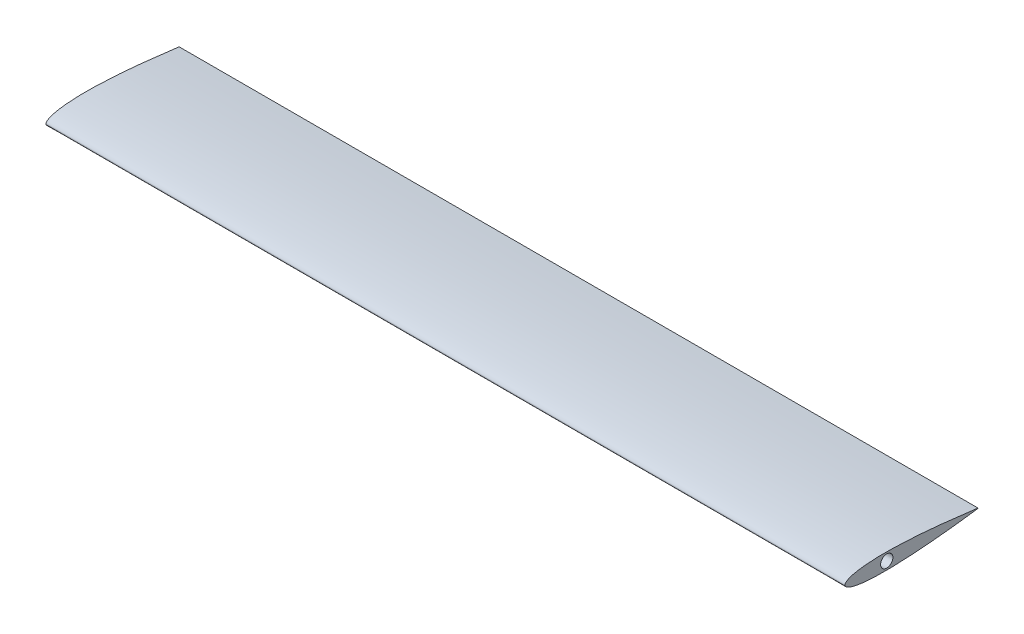
ISO-10303-21;
HEADER;
FILE_DESCRIPTION(('STEP AP214'),'2;1');
FILE_NAME('part.step','',(''),(''),'','','');
FILE_SCHEMA(('AUTOMOTIVE_DESIGN { 1 0 10303 214 1 1 1 1 }'));
ENDSEC;
DATA;
#1=APPLICATION_CONTEXT('core data for automotive mechanical design processes');
#2=APPLICATION_PROTOCOL_DEFINITION('international standard','automotive_design',2000,#1);
#3=PRODUCT_CONTEXT('',#1,'mechanical');
#4=PRODUCT('Part','Part','',(#3));
#5=PRODUCT_RELATED_PRODUCT_CATEGORY('part','',(#4));
#6=PRODUCT_DEFINITION_FORMATION('','',#4);
#7=PRODUCT_DEFINITION_CONTEXT('part definition',#1,'design');
#8=PRODUCT_DEFINITION('design','',#6,#7);
#9=PRODUCT_DEFINITION_SHAPE('','',#8);
#10=(LENGTH_UNIT() NAMED_UNIT(*) SI_UNIT(.MILLI.,.METRE.));
#11=(NAMED_UNIT(*) PLANE_ANGLE_UNIT() SI_UNIT($,.RADIAN.));
#12=(NAMED_UNIT(*) SI_UNIT($,.STERADIAN.) SOLID_ANGLE_UNIT());
#13=UNCERTAINTY_MEASURE_WITH_UNIT(LENGTH_MEASURE(1.E-05),#10,'distance_accuracy_value','');
#14=(GEOMETRIC_REPRESENTATION_CONTEXT(3) GLOBAL_UNCERTAINTY_ASSIGNED_CONTEXT((#13)) GLOBAL_UNIT_ASSIGNED_CONTEXT((#10,
#11,#12)) REPRESENTATION_CONTEXT('',''));
#15=CARTESIAN_POINT('',(0.,0.,0.));
#16=DIRECTION('',(0.,0.,1.));
#17=DIRECTION('',(1.,0.,0.));
#18=AXIS2_PLACEMENT_3D('',#15,#16,#17);
#19=CARTESIAN_POINT('',(750.,7.69748541026481,-124.995841148639));
#20=CARTESIAN_POINT('',(750.,8.13297079806969,-121.549441339967));
#21=CARTESIAN_POINT('',(750.,8.8711094317515,-115.707865670304));
#22=CARTESIAN_POINT('',(750.,10.001168495884,-106.612829462784));
#23=CARTESIAN_POINT('',(750.,10.900080960327,-98.7766774485687));
#24=CARTESIAN_POINT('',(750.,11.7180797430692,-91.0104309827741));
#25=CARTESIAN_POINT('',(750.,12.374421583348,-84.4661711660079));
#26=CARTESIAN_POINT('',(750.,13.0108919100097,-77.1231270334049));
#27=CARTESIAN_POINT('',(750.,13.6615586610673,-70.096902966347));
#28=CARTESIAN_POINT('',(750.,14.0382624320619,-63.2321869691896));
#29=CARTESIAN_POINT('',(750.,14.4586464854716,-56.9511833567442));
#30=CARTESIAN_POINT('',(750.,14.7447792836539,-50.1830543119707));
#31=CARTESIAN_POINT('',(750.,14.9288477277546,-43.7131494322692));
#32=CARTESIAN_POINT('',(750.,14.9867694495661,-38.0167473663419));
#33=CARTESIAN_POINT('',(750.,14.9641673572682,-31.8671085177231));
#34=CARTESIAN_POINT('',(750.,14.7641718889759,-25.9611084011886));
#35=CARTESIAN_POINT('',(750.,14.3189228100668,-20.4184783683121));
#36=CARTESIAN_POINT('',(750.,13.9020772787466,-16.0808939192611));
#37=CARTESIAN_POINT('',(750.,13.2766805127196,-11.948417440773));
#38=CARTESIAN_POINT('',(750.,12.4387478677314,-7.87202213430819));
#39=CARTESIAN_POINT('',(750.,11.4815907628938,-4.55145990959005));
#40=CARTESIAN_POINT('',(750.,10.1896156908138,-1.93507828303653));
#41=CARTESIAN_POINT('',(750.,8.86775259773538,-0.419790589282026));
#42=CARTESIAN_POINT('',(750.,7.67644804525767,0.11632820232294));
#43=CARTESIAN_POINT('',(750.,6.57571630783656,-0.228543288672665));
#44=CARTESIAN_POINT('',(750.,5.38282804272362,-1.09205976929891));
#45=CARTESIAN_POINT('',(750.,4.18267580665149,-3.12132983163146));
#46=CARTESIAN_POINT('',(750.,3.12236016112023,-5.83394586751756));
#47=CARTESIAN_POINT('',(750.,2.33803973933592,-8.96942484585597));
#48=CARTESIAN_POINT('',(750.,1.63555506566896,-12.4549344479186));
#49=CARTESIAN_POINT('',(750.,1.05762224526141,-16.3980412905516));
#50=CARTESIAN_POINT('',(750.,0.619305341649041,-20.4073734698152));
#51=CARTESIAN_POINT('',(750.,0.31851410484638,-24.9404968445985));
#52=CARTESIAN_POINT('',(750.,0.0979146932351296,-28.9969109003526));
#53=CARTESIAN_POINT('',(750.,0.0649508194327663,-33.6403576750408));
#54=CARTESIAN_POINT('',(750.,-0.00877400175199696,-37.6198248379226));
#55=CARTESIAN_POINT('',(750.,0.015166900275881,-42.1302311610639));
#56=CARTESIAN_POINT('',(750.,0.128099619747481,-46.8254786090486));
#57=CARTESIAN_POINT('',(750.,0.308197082911385,-52.0592292594811));
#58=CARTESIAN_POINT('',(750.,0.566048003035137,-57.5702731705481));
#59=CARTESIAN_POINT('',(750.,0.903534980744857,-63.0665569396856));
#60=CARTESIAN_POINT('',(750.,1.27356010427155,-68.7815874397308));
#61=CARTESIAN_POINT('',(750.,1.70119585281695,-74.2410513997578));
#62=CARTESIAN_POINT('',(750.,2.13196813018693,-79.3320789909935));
#63=CARTESIAN_POINT('',(750.,2.52583779535599,-83.7651352480584));
#64=CARTESIAN_POINT('',(750.,3.01497217512738,-88.3338625479964));
#65=CARTESIAN_POINT('',(750.,3.49549121200945,-93.4518819084549));
#66=CARTESIAN_POINT('',(750.,4.03066318219639,-98.4485149275409));
#67=CARTESIAN_POINT('',(750.,4.55967089304909,-103.359945305802));
#68=CARTESIAN_POINT('',(750.,5.05105140142525,-107.534749069242));
#69=CARTESIAN_POINT('',(750.,5.65258932830013,-112.036034411145));
#70=CARTESIAN_POINT('',(750.,6.20511451438241,-116.898948087647));
#71=CARTESIAN_POINT('',(750.,6.89818955039856,-121.185254011005));
#72=CARTESIAN_POINT('',(750.,7.13557750543474,-124.034905271131));
#73=CARTESIAN_POINT('',(750.,7.32673022277285,-124.871587069256));
#74=CARTESIAN_POINT('',(750.,7.3551179622547,-124.995841148639));
#75=B_SPLINE_CURVE_WITH_KNOTS('',3,(#19,#20,#21,#22,#23,#24,#25,#26,#27,#28,#29,#30,#31,#32,#33,
#34,#35,#36,#37,#38,#39,#40,#41,#42,#43,#44,#45,#46,#47,#48,#49,#50,#51,#52,#53,#54,#55,#56,#57,
#58,#59,#60,#61,#62,#63,#64,#65,#66,#67,#68,#69,#70,#71,#72,#73,#74),.UNSPECIFIED.,.F.,.F.,(4,1,
1,1,1,1,1,1,1,1,1,1,1,1,1,1,1,1,1,1,1,1,1,1,1,1,1,1,1,1,1,1,1,1,1,1,1,1,1,1,1,1,1,1,1,1,1,1,1,1,
1,1,1,4),(0.,0.0409096927672382,0.069341074509443,0.107932085318759,0.13379571453232,
0.16130729717174,0.185385503767664,0.220597865919934,0.244393633444343,0.266343568343719,
0.294730889223809,0.324163187557855,0.342565083334242,0.361815516183744,0.396586444452688,
0.412117027739434,0.427295280855564,0.447896389869057,0.461301180767998,0.476284913180007,
0.488528162874039,0.495261637278021,0.499815716845931,0.502760784822896,0.508369898484513,
0.516837025917484,0.529992214815813,0.542688858921217,0.554812189598935,0.571870003296213,
0.589595673628932,0.602296180079901,0.625369139144534,0.637420540621771,0.656976539844779,
0.672241266584835,0.690533980122457,0.712285020909276,0.733912637938034,0.755503976489473,
0.777133728985755,0.801356586058894,0.819993044264083,0.837303590830548,0.853766864034959,
0.874103184409616,0.897840615251757,0.912945775380075,0.93227821936547,0.947341946687704,
0.966428855971776,0.989896212666448,0.998499505073226,1.),.UNSPECIFIED.);
#76=DIRECTION('',(-1.,0.,0.));
#77=VECTOR('',#76,1.);
#78=SURFACE_OF_LINEAR_EXTRUSION('',#75,#77);
#79=CARTESIAN_POINT('',(0.,7.69748541026481,-124.995841148639));
#80=CARTESIAN_POINT('',(0.,8.13297079806969,-121.549441339967));
#81=CARTESIAN_POINT('',(0.,8.8711094317515,-115.707865670304));
#82=CARTESIAN_POINT('',(0.,10.001168495884,-106.612829462784));
#83=CARTESIAN_POINT('',(0.,10.900080960327,-98.7766774485687));
#84=CARTESIAN_POINT('',(0.,11.7180797430692,-91.0104309827741));
#85=CARTESIAN_POINT('',(0.,12.374421583348,-84.4661711660079));
#86=CARTESIAN_POINT('',(0.,13.0108919100097,-77.1231270334049));
#87=CARTESIAN_POINT('',(0.,13.6615586610673,-70.096902966347));
#88=CARTESIAN_POINT('',(0.,14.0382624320619,-63.2321869691896));
#89=CARTESIAN_POINT('',(0.,14.4586464854716,-56.9511833567442));
#90=CARTESIAN_POINT('',(0.,14.7447792836539,-50.1830543119707));
#91=CARTESIAN_POINT('',(0.,14.9288477277546,-43.7131494322692));
#92=CARTESIAN_POINT('',(0.,14.9867694495661,-38.0167473663419));
#93=CARTESIAN_POINT('',(0.,14.9641673572682,-31.8671085177231));
#94=CARTESIAN_POINT('',(0.,14.7641718889759,-25.9611084011886));
#95=CARTESIAN_POINT('',(0.,14.3189228100668,-20.4184783683121));
#96=CARTESIAN_POINT('',(0.,13.9020772787466,-16.0808939192611));
#97=CARTESIAN_POINT('',(0.,13.2766805127196,-11.948417440773));
#98=CARTESIAN_POINT('',(0.,12.4387478677314,-7.87202213430819));
#99=CARTESIAN_POINT('',(0.,11.4815907628938,-4.55145990959005));
#100=CARTESIAN_POINT('',(0.,10.1896156908138,-1.93507828303653));
#101=CARTESIAN_POINT('',(0.,8.86775259773538,-0.419790589282026));
#102=CARTESIAN_POINT('',(0.,7.67644804525767,0.11632820232294));
#103=CARTESIAN_POINT('',(0.,6.57571630783656,-0.228543288672665));
#104=CARTESIAN_POINT('',(0.,5.38282804272362,-1.09205976929891));
#105=CARTESIAN_POINT('',(0.,4.18267580665149,-3.12132983163146));
#106=CARTESIAN_POINT('',(0.,3.12236016112023,-5.83394586751756));
#107=CARTESIAN_POINT('',(0.,2.33803973933592,-8.96942484585597));
#108=CARTESIAN_POINT('',(0.,1.63555506566896,-12.4549344479186));
#109=CARTESIAN_POINT('',(0.,1.05762224526141,-16.3980412905516));
#110=CARTESIAN_POINT('',(0.,0.619305341649041,-20.4073734698152));
#111=CARTESIAN_POINT('',(0.,0.31851410484638,-24.9404968445985));
#112=CARTESIAN_POINT('',(0.,0.0979146932351296,-28.9969109003526));
#113=CARTESIAN_POINT('',(0.,0.0649508194327663,-33.6403576750408));
#114=CARTESIAN_POINT('',(0.,-0.00877400175199696,-37.6198248379226));
#115=CARTESIAN_POINT('',(0.,0.015166900275881,-42.1302311610639));
#116=CARTESIAN_POINT('',(0.,0.128099619747481,-46.8254786090486));
#117=CARTESIAN_POINT('',(0.,0.308197082911385,-52.0592292594811));
#118=CARTESIAN_POINT('',(0.,0.566048003035137,-57.5702731705481));
#119=CARTESIAN_POINT('',(0.,0.903534980744857,-63.0665569396856));
#120=CARTESIAN_POINT('',(0.,1.27356010427155,-68.7815874397308));
#121=CARTESIAN_POINT('',(0.,1.70119585281695,-74.2410513997578));
#122=CARTESIAN_POINT('',(0.,2.13196813018693,-79.3320789909935));
#123=CARTESIAN_POINT('',(0.,2.52583779535599,-83.7651352480584));
#124=CARTESIAN_POINT('',(0.,3.01497217512738,-88.3338625479964));
#125=CARTESIAN_POINT('',(0.,3.49549121200945,-93.4518819084549));
#126=CARTESIAN_POINT('',(0.,4.03066318219639,-98.4485149275409));
#127=CARTESIAN_POINT('',(0.,4.55967089304909,-103.359945305802));
#128=CARTESIAN_POINT('',(0.,5.05105140142525,-107.534749069242));
#129=CARTESIAN_POINT('',(0.,5.65258932830013,-112.036034411145));
#130=CARTESIAN_POINT('',(0.,6.20511451438241,-116.898948087647));
#131=CARTESIAN_POINT('',(0.,6.89818955039856,-121.185254011005));
#132=CARTESIAN_POINT('',(0.,7.13557750543474,-124.034905271131));
#133=CARTESIAN_POINT('',(0.,7.32673022277285,-124.871587069256));
#134=CARTESIAN_POINT('',(0.,7.3551179622547,-124.995841148639));
#135=B_SPLINE_CURVE_WITH_KNOTS('',3,(#79,#80,#81,#82,#83,#84,#85,#86,#87,#88,#89,#90,#91,#92,
#93,#94,#95,#96,#97,#98,#99,#100,#101,#102,#103,#104,#105,#106,#107,#108,#109,#110,#111,#112,
#113,#114,#115,#116,#117,#118,#119,#120,#121,#122,#123,#124,#125,#126,#127,#128,#129,#130,#131,
#132,#133,#134),.UNSPECIFIED.,.F.,.F.,(4,1,1,1,1,1,1,1,1,1,1,1,1,1,1,1,1,1,1,1,1,1,1,1,1,1,1,1,
1,1,1,1,1,1,1,1,1,1,1,1,1,1,1,1,1,1,1,1,1,1,1,1,1,4),(0.,0.0409096927672382,0.069341074509443,
0.107932085318759,0.13379571453232,0.16130729717174,0.185385503767664,0.220597865919934,
0.244393633444343,0.266343568343719,0.294730889223809,0.324163187557855,0.342565083334242,
0.361815516183744,0.396586444452688,0.412117027739434,0.427295280855564,0.447896389869057,
0.461301180767998,0.476284913180007,0.488528162874039,0.495261637278021,0.499815716845931,
0.502760784822896,0.508369898484513,0.516837025917484,0.529992214815813,0.542688858921217,
0.554812189598935,0.571870003296213,0.589595673628932,0.602296180079901,0.625369139144534,
0.637420540621771,0.656976539844779,0.672241266584835,0.690533980122457,0.712285020909276,
0.733912637938034,0.755503976489473,0.777133728985755,0.801356586058894,0.819993044264083,
0.837303590830548,0.853766864034959,0.874103184409616,0.897840615251757,0.912945775380075,
0.93227821936547,0.947341946687704,0.966428855971776,0.989896212666448,0.998499505073226,1.),.UNSPECIFIED.);
#136=CARTESIAN_POINT('',(0.,7.69748541026481,-124.995841148639));
#137=VERTEX_POINT('',#136);
#138=CARTESIAN_POINT('',(0.,7.3551179622547,-124.995841148639));
#139=VERTEX_POINT('',#138);
#140=EDGE_CURVE('E68',#137,#139,#135,.T.);
#141=ORIENTED_EDGE('',*,*,#140,.T.);
#142=DIRECTION('',(-1.,0.,0.));
#143=VECTOR('',#142,1.);
#144=CARTESIAN_POINT('',(750.,7.3551179622547,-124.995841148639));
#145=LINE('',#144,#143);
#146=CARTESIAN_POINT('',(750.,7.3551179622547,-124.995841148639));
#147=VERTEX_POINT('',#146);
#148=EDGE_CURVE('E11',#147,#139,#145,.T.);
#149=ORIENTED_EDGE('',*,*,#148,.F.);
#150=CARTESIAN_POINT('',(750.,7.69748541026481,-124.995841148639));
#151=VERTEX_POINT('',#150);
#152=EDGE_CURVE('E67',#151,#147,#75,.T.);
#153=ORIENTED_EDGE('',*,*,#152,.F.);
#154=DIRECTION('',(-1.,0.,0.));
#155=VECTOR('',#154,1.);
#156=CARTESIAN_POINT('',(750.,7.69748541026481,-124.995841148639));
#157=LINE('',#156,#155);
#158=EDGE_CURVE('E45',#151,#137,#157,.T.);
#159=ORIENTED_EDGE('',*,*,#158,.T.);
#160=EDGE_LOOP('',(#141,#149,#153,#159));
#161=FACE_BOUND('',#160,.T.);
#162=ADVANCED_FACE('F36',(#161),#78,.F.);
#163=CARTESIAN_POINT('',(750.,7.69748541026481,-124.995841148639));
#164=DIRECTION('',(0.,0.,1.));
#165=DIRECTION('',(1.,0.,0.));
#166=AXIS2_PLACEMENT_3D('',#163,#164,#165);
#167=PLANE('',#166);
#168=DIRECTION('',(0.,1.,0.));
#169=VECTOR('',#168,1.);
#170=CARTESIAN_POINT('',(0.,7.69748541026481,-124.995841148639));
#171=LINE('',#170,#169);
#172=EDGE_CURVE('E60',#139,#137,#171,.T.);
#173=ORIENTED_EDGE('',*,*,#172,.T.);
#174=ORIENTED_EDGE('',*,*,#158,.F.);
#175=DIRECTION('',(0.,1.,0.));
#176=VECTOR('',#175,1.);
#177=CARTESIAN_POINT('',(750.,7.69748541026481,-124.995841148639));
#178=LINE('',#177,#176);
#179=EDGE_CURVE('E52',#147,#151,#178,.T.);
#180=ORIENTED_EDGE('',*,*,#179,.F.);
#181=ORIENTED_EDGE('',*,*,#148,.T.);
#182=EDGE_LOOP('',(#173,#174,#180,#181));
#183=FACE_BOUND('',#182,.T.);
#184=ADVANCED_FACE('F63',(#183),#167,.F.);
#185=CARTESIAN_POINT('',(750.,7.49465768006498,-0.00151174548001801));
#186=DIRECTION('',(-1.,0.,0.));
#187=DIRECTION('',(0.,0.,1.));
#188=AXIS2_PLACEMENT_3D('',#185,#186,#187);
#189=PLANE('',#188);
#190=CARTESIAN_POINT('',(750.,7.48680459495459,-39.3202558778408));
#191=DIRECTION('',(-1.,0.,0.));
#192=DIRECTION('',(0.,0.,1.));
#193=AXIS2_PLACEMENT_3D('',#190,#191,#192);
#194=CIRCLE('',#193,5.75);
#195=CARTESIAN_POINT('',(750.,7.48680459495459,-33.5702558778408));
#196=VERTEX_POINT('',#195);
#197=EDGE_CURVE('E72',#196,#196,#194,.T.);
#198=ORIENTED_EDGE('',*,*,#197,.T.);
#199=EDGE_LOOP('',(#198));
#200=FACE_BOUND('',#199,.T.);
#201=ORIENTED_EDGE('',*,*,#152,.T.);
#202=ORIENTED_EDGE('',*,*,#179,.T.);
#203=EDGE_LOOP('',(#201,#202));
#204=FACE_BOUND('',#203,.T.);
#205=ADVANCED_FACE('F97',(#200,#204),#189,.F.);
#206=CARTESIAN_POINT('',(0.,7.49465768006498,-0.00151174548001801));
#207=DIRECTION('',(-1.,0.,0.));
#208=DIRECTION('',(0.,0.,1.));
#209=AXIS2_PLACEMENT_3D('',#206,#207,#208);
#210=PLANE('',#209);
#211=CARTESIAN_POINT('',(0.,7.48680459495459,-39.3202558778408));
#212=DIRECTION('',(-1.,0.,0.));
#213=DIRECTION('',(0.,0.,1.));
#214=AXIS2_PLACEMENT_3D('',#211,#212,#213);
#215=CIRCLE('',#214,5.75);
#216=CARTESIAN_POINT('',(0.,7.48680459495459,-33.5702558778408));
#217=VERTEX_POINT('',#216);
#218=EDGE_CURVE('E75',#217,#217,#215,.T.);
#219=ORIENTED_EDGE('',*,*,#218,.F.);
#220=EDGE_LOOP('',(#219));
#221=FACE_BOUND('',#220,.T.);
#222=ORIENTED_EDGE('',*,*,#140,.F.);
#223=ORIENTED_EDGE('',*,*,#172,.F.);
#224=EDGE_LOOP('',(#222,#223));
#225=FACE_BOUND('',#224,.T.);
#226=ADVANCED_FACE('F71',(#221,#225),#210,.T.);
#227=CARTESIAN_POINT('',(804.,7.48680459495459,-39.3202558778408));
#228=DIRECTION('',(-1.,0.,0.));
#229=DIRECTION('',(0.,0.,1.));
#230=AXIS2_PLACEMENT_3D('',#227,#228,#229);
#231=CYLINDRICAL_SURFACE('',#230,5.75);
#232=ORIENTED_EDGE('',*,*,#218,.T.);
#233=EDGE_LOOP('',(#232));
#234=FACE_BOUND('',#233,.T.);
#235=ORIENTED_EDGE('',*,*,#197,.F.);
#236=EDGE_LOOP('',(#235));
#237=FACE_BOUND('',#236,.T.);
#238=ADVANCED_FACE('F93',(#234,#237),#231,.F.);
#239=CLOSED_SHELL('',(#162,#184,#205,#226,#238));
#240=MANIFOLD_SOLID_BREP('B2',#239);
#241=ADVANCED_BREP_SHAPE_REPRESENTATION('',(#18,#240),#14);
#242=SHAPE_DEFINITION_REPRESENTATION(#9,#241);
ENDSEC;
END-ISO-10303-21;
